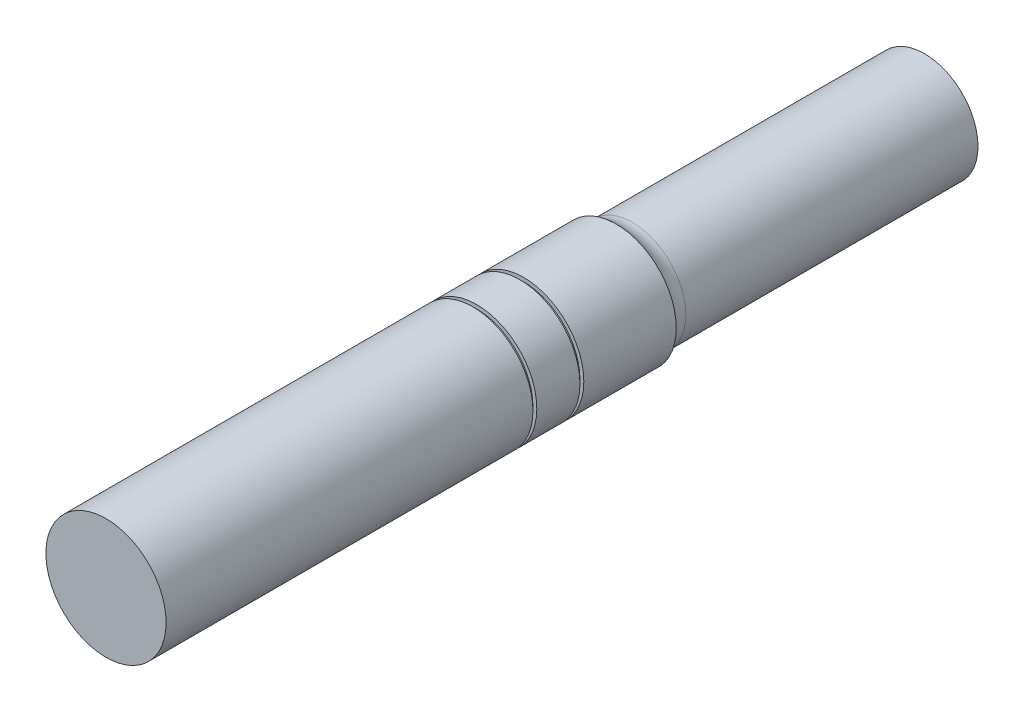
ISO-10303-21;
HEADER;
FILE_DESCRIPTION(('STEP AP214'),'2;1');
FILE_NAME('part.step','',(''),(''),'','','');
FILE_SCHEMA(('AUTOMOTIVE_DESIGN { 1 0 10303 214 1 1 1 1 }'));
ENDSEC;
DATA;
#1=APPLICATION_CONTEXT('core data for automotive mechanical design processes');
#2=APPLICATION_PROTOCOL_DEFINITION('international standard','automotive_design',2000,#1);
#3=PRODUCT_CONTEXT('',#1,'mechanical');
#4=PRODUCT('Part','Part','',(#3));
#5=PRODUCT_RELATED_PRODUCT_CATEGORY('part','',(#4));
#6=PRODUCT_DEFINITION_FORMATION('','',#4);
#7=PRODUCT_DEFINITION_CONTEXT('part definition',#1,'design');
#8=PRODUCT_DEFINITION('design','',#6,#7);
#9=PRODUCT_DEFINITION_SHAPE('','',#8);
#10=(LENGTH_UNIT() NAMED_UNIT(*) SI_UNIT(.MILLI.,.METRE.));
#11=(NAMED_UNIT(*) PLANE_ANGLE_UNIT() SI_UNIT($,.RADIAN.));
#12=(NAMED_UNIT(*) SI_UNIT($,.STERADIAN.) SOLID_ANGLE_UNIT());
#13=UNCERTAINTY_MEASURE_WITH_UNIT(LENGTH_MEASURE(1.E-05),#10,'distance_accuracy_value','');
#14=(GEOMETRIC_REPRESENTATION_CONTEXT(3) GLOBAL_UNCERTAINTY_ASSIGNED_CONTEXT((#13)) GLOBAL_UNIT_ASSIGNED_CONTEXT((#10,
#11,#12)) REPRESENTATION_CONTEXT('',''));
#15=CARTESIAN_POINT('',(0.,0.,0.));
#16=DIRECTION('',(0.,0.,1.));
#17=DIRECTION('',(1.,0.,0.));
#18=AXIS2_PLACEMENT_3D('',#15,#16,#17);
#19=CARTESIAN_POINT('',(0.,0.,127.));
#20=DIRECTION('',(0.,0.,1.));
#21=DIRECTION('',(1.,0.,0.));
#22=AXIS2_PLACEMENT_3D('',#19,#20,#21);
#23=CYLINDRICAL_SURFACE('',#22,1.8542);
#24=CARTESIAN_POINT('',(0.,0.,-0.152399999999997));
#25=DIRECTION('',(0.,0.,1.));
#26=DIRECTION('',(1.,0.,0.));
#27=AXIS2_PLACEMENT_3D('',#24,#25,#26);
#28=CIRCLE('',#27,1.8542);
#29=CARTESIAN_POINT('',(1.8542,0.,-0.152399999999997));
#30=VERTEX_POINT('',#29);
#31=EDGE_CURVE('E92',#30,#30,#28,.T.);
#32=ORIENTED_EDGE('',*,*,#31,.F.);
#33=EDGE_LOOP('',(#32));
#34=FACE_BOUND('',#33,.T.);
#35=CARTESIAN_POINT('',(0.,0.,-0.279400000000013));
#36=DIRECTION('',(0.,0.,1.));
#37=DIRECTION('',(1.,0.,0.));
#38=AXIS2_PLACEMENT_3D('',#35,#36,#37);
#39=CIRCLE('',#38,1.8542);
#40=CARTESIAN_POINT('',(1.8542,0.,-0.279400000000013));
#41=VERTEX_POINT('',#40);
#42=EDGE_CURVE('E60',#41,#41,#39,.T.);
#43=ORIENTED_EDGE('',*,*,#42,.T.);
#44=EDGE_LOOP('',(#43));
#45=FACE_BOUND('',#44,.T.);
#46=ADVANCED_FACE('F39',(#34,#45),#23,.T.);
#47=CARTESIAN_POINT('',(0.,1.9812,-0.15240000000001));
#48=DIRECTION('',(0.,0.,1.));
#49=DIRECTION('',(1.,0.,0.));
#50=AXIS2_PLACEMENT_3D('',#47,#48,#49);
#51=PLANE('',#50);
#52=CARTESIAN_POINT('',(0.,0.,-0.152399999999997));
#53=DIRECTION('',(0.,0.,1.));
#54=DIRECTION('',(1.,0.,0.));
#55=AXIS2_PLACEMENT_3D('',#52,#53,#54);
#56=CIRCLE('',#55,1.9812);
#57=CARTESIAN_POINT('',(1.9812,0.,-0.152399999999997));
#58=VERTEX_POINT('',#57);
#59=EDGE_CURVE('E89',#58,#58,#56,.T.);
#60=ORIENTED_EDGE('',*,*,#59,.F.);
#61=EDGE_LOOP('',(#60));
#62=FACE_BOUND('',#61,.T.);
#63=ORIENTED_EDGE('',*,*,#31,.T.);
#64=EDGE_LOOP('',(#63));
#65=FACE_BOUND('',#64,.T.);
#66=ADVANCED_FACE('F109',(#62,#65),#51,.F.);
#67=CARTESIAN_POINT('',(0.,0.,127.));
#68=DIRECTION('',(0.,0.,1.));
#69=DIRECTION('',(1.,0.,0.));
#70=AXIS2_PLACEMENT_3D('',#67,#68,#69);
#71=CYLINDRICAL_SURFACE('',#70,1.9812);
#72=CARTESIAN_POINT('',(0.,0.,1.26999999999999));
#73=DIRECTION('',(0.,0.,1.));
#74=DIRECTION('',(1.,0.,0.));
#75=AXIS2_PLACEMENT_3D('',#72,#73,#74);
#76=CIRCLE('',#75,1.9812);
#77=CARTESIAN_POINT('',(1.9812,0.,1.26999999999999));
#78=VERTEX_POINT('',#77);
#79=EDGE_CURVE('E86',#78,#78,#76,.T.);
#80=ORIENTED_EDGE('',*,*,#79,.F.);
#81=EDGE_LOOP('',(#80));
#82=FACE_BOUND('',#81,.T.);
#83=ORIENTED_EDGE('',*,*,#59,.T.);
#84=EDGE_LOOP('',(#83));
#85=FACE_BOUND('',#84,.T.);
#86=ADVANCED_FACE('F115',(#82,#85),#71,.T.);
#87=CARTESIAN_POINT('',(0.,1.9812,1.26999999999999));
#88=DIRECTION('',(0.,0.,-1.));
#89=DIRECTION('',(-1.,0.,0.));
#90=AXIS2_PLACEMENT_3D('',#87,#88,#89);
#91=PLANE('',#90);
#92=CARTESIAN_POINT('',(0.,0.,1.26999999999999));
#93=DIRECTION('',(0.,0.,1.));
#94=DIRECTION('',(1.,0.,0.));
#95=AXIS2_PLACEMENT_3D('',#92,#93,#94);
#96=CIRCLE('',#95,1.8542);
#97=CARTESIAN_POINT('',(1.8542,0.,1.26999999999999));
#98=VERTEX_POINT('',#97);
#99=EDGE_CURVE('E83',#98,#98,#96,.T.);
#100=ORIENTED_EDGE('',*,*,#99,.F.);
#101=EDGE_LOOP('',(#100));
#102=FACE_BOUND('',#101,.T.);
#103=ORIENTED_EDGE('',*,*,#79,.T.);
#104=EDGE_LOOP('',(#103));
#105=FACE_BOUND('',#104,.T.);
#106=ADVANCED_FACE('F164',(#102,#105),#91,.F.);
#107=CARTESIAN_POINT('',(0.,0.,127.));
#108=DIRECTION('',(0.,0.,1.));
#109=DIRECTION('',(1.,0.,0.));
#110=AXIS2_PLACEMENT_3D('',#107,#108,#109);
#111=CYLINDRICAL_SURFACE('',#110,1.8542);
#112=CARTESIAN_POINT('',(0.,0.,1.39699999999998));
#113=DIRECTION('',(0.,0.,1.));
#114=DIRECTION('',(1.,0.,0.));
#115=AXIS2_PLACEMENT_3D('',#112,#113,#114);
#116=CIRCLE('',#115,1.8542);
#117=CARTESIAN_POINT('',(1.8542,0.,1.39699999999998));
#118=VERTEX_POINT('',#117);
#119=EDGE_CURVE('E80',#118,#118,#116,.T.);
#120=ORIENTED_EDGE('',*,*,#119,.F.);
#121=EDGE_LOOP('',(#120));
#122=FACE_BOUND('',#121,.T.);
#123=ORIENTED_EDGE('',*,*,#99,.T.);
#124=EDGE_LOOP('',(#123));
#125=FACE_BOUND('',#124,.T.);
#126=ADVANCED_FACE('F160',(#122,#125),#111,.T.);
#127=CARTESIAN_POINT('',(0.,1.8542,1.39699999999999));
#128=DIRECTION('',(0.,0.,1.));
#129=DIRECTION('',(1.,0.,0.));
#130=AXIS2_PLACEMENT_3D('',#127,#128,#129);
#131=PLANE('',#130);
#132=CARTESIAN_POINT('',(0.,0.,1.39699999999998));
#133=DIRECTION('',(0.,0.,1.));
#134=DIRECTION('',(1.,0.,0.));
#135=AXIS2_PLACEMENT_3D('',#132,#133,#134);
#136=CIRCLE('',#135,1.9812);
#137=CARTESIAN_POINT('',(1.9812,0.,1.39699999999998));
#138=VERTEX_POINT('',#137);
#139=EDGE_CURVE('E77',#138,#138,#136,.T.);
#140=ORIENTED_EDGE('',*,*,#139,.F.);
#141=EDGE_LOOP('',(#140));
#142=FACE_BOUND('',#141,.T.);
#143=ORIENTED_EDGE('',*,*,#119,.T.);
#144=EDGE_LOOP('',(#143));
#145=FACE_BOUND('',#144,.T.);
#146=ADVANCED_FACE('F156',(#142,#145),#131,.F.);
#147=CARTESIAN_POINT('',(0.,0.,127.));
#148=DIRECTION('',(0.,0.,1.));
#149=DIRECTION('',(1.,0.,0.));
#150=AXIS2_PLACEMENT_3D('',#147,#148,#149);
#151=CYLINDRICAL_SURFACE('',#150,1.9812);
#152=CARTESIAN_POINT('',(0.,0.,13.4874));
#153=DIRECTION('',(0.,0.,1.));
#154=DIRECTION('',(1.,0.,0.));
#155=AXIS2_PLACEMENT_3D('',#152,#153,#154);
#156=CIRCLE('',#155,1.9812);
#157=CARTESIAN_POINT('',(1.9812,0.,13.4874));
#158=VERTEX_POINT('',#157);
#159=EDGE_CURVE('E74',#158,#158,#156,.T.);
#160=ORIENTED_EDGE('',*,*,#159,.F.);
#161=EDGE_LOOP('',(#160));
#162=FACE_BOUND('',#161,.T.);
#163=ORIENTED_EDGE('',*,*,#139,.T.);
#164=EDGE_LOOP('',(#163));
#165=FACE_BOUND('',#164,.T.);
#166=ADVANCED_FACE('F152',(#162,#165),#151,.T.);
#167=CARTESIAN_POINT('',(0.,0.,13.4874));
#168=DIRECTION('',(0.,0.,-1.));
#169=DIRECTION('',(-1.,0.,0.));
#170=AXIS2_PLACEMENT_3D('',#167,#168,#169);
#171=PLANE('',#170);
#172=ORIENTED_EDGE('',*,*,#159,.T.);
#173=EDGE_LOOP('',(#172));
#174=FACE_BOUND('',#173,.T.);
#175=ADVANCED_FACE('F148',(#174),#171,.F.);
#176=CARTESIAN_POINT('',(0.,1.7653,-13.4874));
#177=DIRECTION('',(0.,0.,1.));
#178=DIRECTION('',(1.,0.,0.));
#179=AXIS2_PLACEMENT_3D('',#176,#177,#178);
#180=PLANE('',#179);
#181=CARTESIAN_POINT('',(0.,0.,-13.4874));
#182=DIRECTION('',(0.,0.,1.));
#183=DIRECTION('',(1.,0.,0.));
#184=AXIS2_PLACEMENT_3D('',#181,#182,#183);
#185=CIRCLE('',#184,1.75895000000001);
#186=CARTESIAN_POINT('',(1.75895000000001,0.,-13.4874));
#187=VERTEX_POINT('',#186);
#188=EDGE_CURVE('E11',#187,#187,#185,.T.);
#189=ORIENTED_EDGE('',*,*,#188,.T.);
#190=EDGE_LOOP('',(#189));
#191=FACE_BOUND('',#190,.T.);
#192=CARTESIAN_POINT('',(0.,0.,-13.4874));
#193=DIRECTION('',(0.,0.,1.));
#194=DIRECTION('',(1.,0.,0.));
#195=AXIS2_PLACEMENT_3D('',#192,#193,#194);
#196=CIRCLE('',#195,1.7653);
#197=CARTESIAN_POINT('',(1.7653,0.,-13.4874));
#198=VERTEX_POINT('',#197);
#199=EDGE_CURVE('E71',#198,#198,#196,.T.);
#200=ORIENTED_EDGE('',*,*,#199,.F.);
#201=EDGE_LOOP('',(#200));
#202=FACE_BOUND('',#201,.T.);
#203=ADVANCED_FACE('F141',(#191,#202),#180,.F.);
#204=CARTESIAN_POINT('',(0.,0.,127.));
#205=DIRECTION('',(0.,0.,1.));
#206=DIRECTION('',(1.,0.,0.));
#207=AXIS2_PLACEMENT_3D('',#204,#205,#206);
#208=CYLINDRICAL_SURFACE('',#207,1.7653);
#209=CARTESIAN_POINT('',(0.,0.,-3.85883088920386));
#210=DIRECTION('',(0.,0.,1.));
#211=DIRECTION('',(1.,0.,0.));
#212=AXIS2_PLACEMENT_3D('',#209,#210,#211);
#213=CIRCLE('',#212,1.7653);
#214=CARTESIAN_POINT('',(1.7653,0.,-3.85883088920386));
#215=VERTEX_POINT('',#214);
#216=EDGE_CURVE('E95',#215,#215,#213,.F.);
#217=ORIENTED_EDGE('',*,*,#216,.T.);
#218=EDGE_LOOP('',(#217));
#219=FACE_BOUND('',#218,.T.);
#220=ORIENTED_EDGE('',*,*,#199,.T.);
#221=EDGE_LOOP('',(#220));
#222=FACE_BOUND('',#221,.T.);
#223=ADVANCED_FACE('F135',(#219,#222),#208,.T.);
#224=CARTESIAN_POINT('',(0.,0.,127.));
#225=DIRECTION('',(0.,0.,1.));
#226=DIRECTION('',(1.,0.,0.));
#227=AXIS2_PLACEMENT_3D('',#224,#225,#226);
#228=CYLINDRICAL_SURFACE('',#227,1.9812);
#229=CARTESIAN_POINT('',(0.,0.,-0.279400000000013));
#230=DIRECTION('',(0.,0.,1.));
#231=DIRECTION('',(1.,0.,0.));
#232=AXIS2_PLACEMENT_3D('',#229,#230,#231);
#233=CIRCLE('',#232,1.9812);
#234=CARTESIAN_POINT('',(1.9812,0.,-0.279400000000013));
#235=VERTEX_POINT('',#234);
#236=EDGE_CURVE('E63',#235,#235,#233,.T.);
#237=ORIENTED_EDGE('',*,*,#236,.F.);
#238=EDGE_LOOP('',(#237));
#239=FACE_BOUND('',#238,.T.);
#240=CARTESIAN_POINT('',(0.,0.,-3.32740000000001));
#241=DIRECTION('',(0.,0.,1.));
#242=DIRECTION('',(1.,0.,0.));
#243=AXIS2_PLACEMENT_3D('',#240,#241,#242);
#244=CIRCLE('',#243,1.9812);
#245=CARTESIAN_POINT('',(1.9812,0.,-3.32740000000001));
#246=VERTEX_POINT('',#245);
#247=EDGE_CURVE('E68',#246,#246,#244,.T.);
#248=ORIENTED_EDGE('',*,*,#247,.T.);
#249=EDGE_LOOP('',(#248));
#250=FACE_BOUND('',#249,.T.);
#251=ADVANCED_FACE('F127',(#239,#250),#228,.T.);
#252=CARTESIAN_POINT('',(0.,1.8542,-0.27940000000001));
#253=DIRECTION('',(0.,0.,-1.));
#254=DIRECTION('',(-1.,0.,0.));
#255=AXIS2_PLACEMENT_3D('',#252,#253,#254);
#256=PLANE('',#255);
#257=ORIENTED_EDGE('',*,*,#42,.F.);
#258=EDGE_LOOP('',(#257));
#259=FACE_BOUND('',#258,.T.);
#260=ORIENTED_EDGE('',*,*,#236,.T.);
#261=EDGE_LOOP('',(#260));
#262=FACE_BOUND('',#261,.T.);
#263=ADVANCED_FACE('F122',(#259,#262),#256,.F.);
#264=CARTESIAN_POINT('',(0.,0.,-3.85883088920386));
#265=DIRECTION('',(0.,0.,1.));
#266=DIRECTION('',(1.,0.,0.));
#267=AXIS2_PLACEMENT_3D('',#264,#265,#266);
#268=TOROIDAL_SURFACE('',#267,2.5273,0.762);
#269=ORIENTED_EDGE('',*,*,#216,.F.);
#270=EDGE_LOOP('',(#269));
#271=FACE_BOUND('',#270,.T.);
#272=ORIENTED_EDGE('',*,*,#247,.F.);
#273=EDGE_LOOP('',(#272));
#274=FACE_BOUND('',#273,.T.);
#275=ADVANCED_FACE('F54',(#271,#274),#268,.F.);
#276=CARTESIAN_POINT('',(0.,0.,-12.4968));
#277=DIRECTION('',(0.,0.,-1.));
#278=DIRECTION('',(-1.,0.,0.));
#279=AXIS2_PLACEMENT_3D('',#276,#277,#278);
#280=CONICAL_SURFACE('',#279,0.9652,1.02974425867665);
#281=CARTESIAN_POINT('',(0.,0.,-11.9168493305146));
#282=VERTEX_POINT('',#281);
#283=VERTEX_LOOP('',#282);
#284=FACE_BOUND('',#283,.T.);
#285=CARTESIAN_POINT('',(0.,0.,-12.4968));
#286=DIRECTION('',(0.,0.,-1.));
#287=DIRECTION('',(-1.,0.,0.));
#288=AXIS2_PLACEMENT_3D('',#285,#286,#287);
#289=CIRCLE('',#288,0.9652);
#290=CARTESIAN_POINT('',(-0.9652,0.,-12.4968));
#291=VERTEX_POINT('',#290);
#292=EDGE_CURVE('E58',#291,#291,#289,.T.);
#293=ORIENTED_EDGE('',*,*,#292,.T.);
#294=EDGE_LOOP('',(#293));
#295=FACE_BOUND('',#294,.T.);
#296=ADVANCED_FACE('F50',(#284,#295),#280,.F.);
#297=CARTESIAN_POINT('',(0.,0.,-13.4874));
#298=DIRECTION('',(0.,0.,-1.));
#299=DIRECTION('',(-1.,0.,0.));
#300=AXIS2_PLACEMENT_3D('',#297,#298,#299);
#301=CYLINDRICAL_SURFACE('',#300,0.9652);
#302=CARTESIAN_POINT('',(0.,0.,-13.0291282238307));
#303=DIRECTION('',(0.,0.,1.));
#304=DIRECTION('',(1.,0.,0.));
#305=AXIS2_PLACEMENT_3D('',#302,#303,#304);
#306=CIRCLE('',#305,0.9652);
#307=CARTESIAN_POINT('',(0.9652,0.,-13.0291282238307));
#308=VERTEX_POINT('',#307);
#309=EDGE_CURVE('E47',#308,#308,#306,.F.);
#310=ORIENTED_EDGE('',*,*,#309,.T.);
#311=EDGE_LOOP('',(#310));
#312=FACE_BOUND('',#311,.T.);
#313=ORIENTED_EDGE('',*,*,#292,.F.);
#314=EDGE_LOOP('',(#313));
#315=FACE_BOUND('',#314,.T.);
#316=ADVANCED_FACE('F53',(#312,#315),#301,.F.);
#317=CARTESIAN_POINT('',(0.,0.,-13.0291282238307));
#318=DIRECTION('',(0.,0.,-1.));
#319=DIRECTION('',(-1.,0.,0.));
#320=AXIS2_PLACEMENT_3D('',#317,#318,#319);
#321=CONICAL_SURFACE('',#320,0.9652,1.0471975511966);
#322=ORIENTED_EDGE('',*,*,#188,.F.);
#323=EDGE_LOOP('',(#322));
#324=FACE_BOUND('',#323,.T.);
#325=ORIENTED_EDGE('',*,*,#309,.F.);
#326=EDGE_LOOP('',(#325));
#327=FACE_BOUND('',#326,.T.);
#328=ADVANCED_FACE('F42',(#324,#327),#321,.F.);
#329=CLOSED_SHELL('',(#46,#66,#86,#106,#126,#146,#166,#175,#203,#223,#251,#263,#275,#296,#316,#328));
#330=MANIFOLD_SOLID_BREP('B2',#329);
#331=ADVANCED_BREP_SHAPE_REPRESENTATION('',(#18,#330),#14);
#332=SHAPE_DEFINITION_REPRESENTATION(#9,#331);
ENDSEC;
END-ISO-10303-21;
